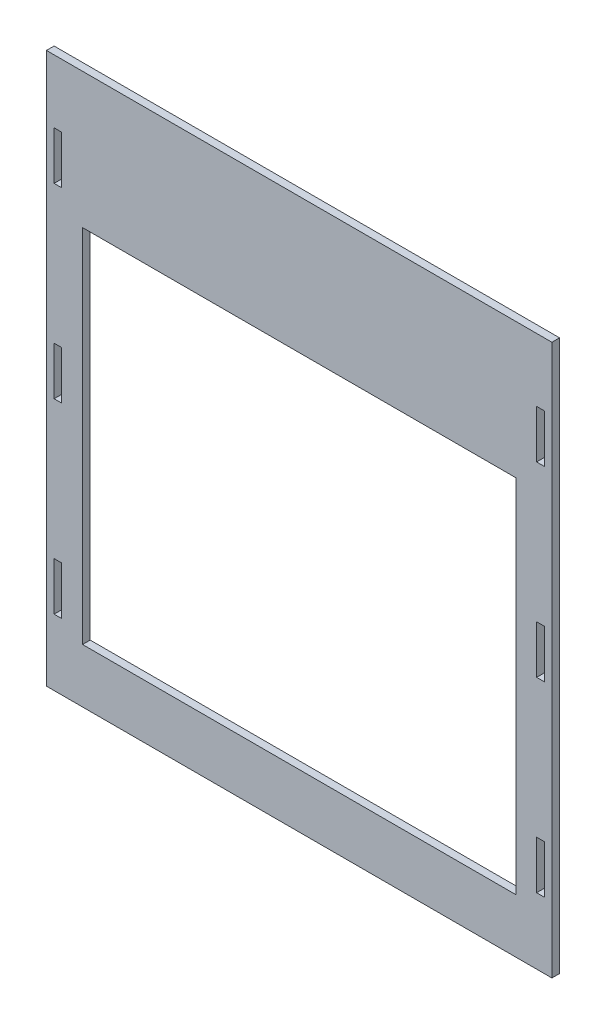
ISO-10303-21;
HEADER;
FILE_DESCRIPTION(('STEP AP214'),'2;1');
FILE_NAME('part.step','',(''),(''),'','','');
FILE_SCHEMA(('AUTOMOTIVE_DESIGN { 1 0 10303 214 1 1 1 1 }'));
ENDSEC;
DATA;
#1=APPLICATION_CONTEXT('core data for automotive mechanical design processes');
#2=APPLICATION_PROTOCOL_DEFINITION('international standard','automotive_design',2000,#1);
#3=PRODUCT_CONTEXT('',#1,'mechanical');
#4=PRODUCT('Part','Part','',(#3));
#5=PRODUCT_RELATED_PRODUCT_CATEGORY('part','',(#4));
#6=PRODUCT_DEFINITION_FORMATION('','',#4);
#7=PRODUCT_DEFINITION_CONTEXT('part definition',#1,'design');
#8=PRODUCT_DEFINITION('design','',#6,#7);
#9=PRODUCT_DEFINITION_SHAPE('','',#8);
#10=(LENGTH_UNIT() NAMED_UNIT(*) SI_UNIT(.MILLI.,.METRE.));
#11=(NAMED_UNIT(*) PLANE_ANGLE_UNIT() SI_UNIT($,.RADIAN.));
#12=(NAMED_UNIT(*) SI_UNIT($,.STERADIAN.) SOLID_ANGLE_UNIT());
#13=UNCERTAINTY_MEASURE_WITH_UNIT(LENGTH_MEASURE(1.E-05),#10,'distance_accuracy_value','');
#14=(GEOMETRIC_REPRESENTATION_CONTEXT(3) GLOBAL_UNCERTAINTY_ASSIGNED_CONTEXT((#13)) GLOBAL_UNIT_ASSIGNED_CONTEXT((#10,
#11,#12)) REPRESENTATION_CONTEXT('',''));
#15=CARTESIAN_POINT('',(0.,0.,0.));
#16=DIRECTION('',(0.,0.,1.));
#17=DIRECTION('',(1.,0.,0.));
#18=AXIS2_PLACEMENT_3D('',#15,#16,#17);
#19=CARTESIAN_POINT('',(0.,0.,6.35));
#20=DIRECTION('',(0.,0.,-1.));
#21=DIRECTION('',(-1.,0.,0.));
#22=AXIS2_PLACEMENT_3D('',#19,#20,#21);
#23=PLANE('',#22);
#24=DIRECTION('',(-1.,0.,0.));
#25=VECTOR('',#24,1.);
#26=CARTESIAN_POINT('',(407.3,95.,6.35));
#27=LINE('',#26,#25);
#28=CARTESIAN_POINT('',(413.65,95.,6.35));
#29=VERTEX_POINT('',#28);
#30=CARTESIAN_POINT('',(407.3,95.,6.35));
#31=VERTEX_POINT('',#30);
#32=EDGE_CURVE('E281',#29,#31,#27,.T.);
#33=ORIENTED_EDGE('',*,*,#32,.F.);
#34=DIRECTION('',(0.,1.,0.));
#35=VECTOR('',#34,1.);
#36=CARTESIAN_POINT('',(413.65,95.,6.35));
#37=LINE('',#36,#35);
#38=CARTESIAN_POINT('',(413.65,55.,6.35));
#39=VERTEX_POINT('',#38);
#40=EDGE_CURVE('E289',#39,#29,#37,.T.);
#41=ORIENTED_EDGE('',*,*,#40,.F.);
#42=DIRECTION('',(1.,0.,0.));
#43=VECTOR('',#42,1.);
#44=CARTESIAN_POINT('',(413.65,55.,6.35));
#45=LINE('',#44,#43);
#46=CARTESIAN_POINT('',(407.3,55.,6.35));
#47=VERTEX_POINT('',#46);
#48=EDGE_CURVE('E286',#47,#39,#45,.T.);
#49=ORIENTED_EDGE('',*,*,#48,.F.);
#50=DIRECTION('',(0.,-1.,0.));
#51=VECTOR('',#50,1.);
#52=CARTESIAN_POINT('',(407.3,55.,6.35));
#53=LINE('',#52,#51);
#54=EDGE_CURVE('E283',#31,#47,#53,.T.);
#55=ORIENTED_EDGE('',*,*,#54,.F.);
#56=EDGE_LOOP('',(#33,#41,#49,#55));
#57=FACE_BOUND('',#56,.T.);
#58=DIRECTION('',(-1.,0.,0.));
#59=VECTOR('',#58,1.);
#60=CARTESIAN_POINT('',(6.35000000000008,250.,6.35));
#61=LINE('',#60,#59);
#62=CARTESIAN_POINT('',(12.7,250.,6.35));
#63=VERTEX_POINT('',#62);
#64=CARTESIAN_POINT('',(6.35000000000008,250.,6.35));
#65=VERTEX_POINT('',#64);
#66=EDGE_CURVE('E343',#63,#65,#61,.T.);
#67=ORIENTED_EDGE('',*,*,#66,.F.);
#68=DIRECTION('',(0.,1.,0.));
#69=VECTOR('',#68,1.);
#70=CARTESIAN_POINT('',(12.7,250.,6.35));
#71=LINE('',#70,#69);
#72=CARTESIAN_POINT('',(12.7,210.,6.35));
#73=VERTEX_POINT('',#72);
#74=EDGE_CURVE('E351',#73,#63,#71,.T.);
#75=ORIENTED_EDGE('',*,*,#74,.F.);
#76=DIRECTION('',(1.,0.,0.));
#77=VECTOR('',#76,1.);
#78=CARTESIAN_POINT('',(12.7,210.,6.35));
#79=LINE('',#78,#77);
#80=CARTESIAN_POINT('',(6.35000000000009,210.,6.35));
#81=VERTEX_POINT('',#80);
#82=EDGE_CURVE('E348',#81,#73,#79,.T.);
#83=ORIENTED_EDGE('',*,*,#82,.F.);
#84=DIRECTION('',(0.,-1.,0.));
#85=VECTOR('',#84,1.);
#86=CARTESIAN_POINT('',(6.35000000000009,210.,6.35));
#87=LINE('',#86,#85);
#88=EDGE_CURVE('E345',#65,#81,#87,.T.);
#89=ORIENTED_EDGE('',*,*,#88,.F.);
#90=EDGE_LOOP('',(#67,#75,#83,#89));
#91=FACE_BOUND('',#90,.T.);
#92=DIRECTION('',(0.,-1.,0.));
#93=VECTOR('',#92,1.);
#94=CARTESIAN_POINT('',(407.3,365.,6.35));
#95=LINE('',#94,#93);
#96=CARTESIAN_POINT('',(407.3,405.,6.35));
#97=VERTEX_POINT('',#96);
#98=CARTESIAN_POINT('',(407.3,365.,6.35));
#99=VERTEX_POINT('',#98);
#100=EDGE_CURVE('E405',#97,#99,#95,.T.);
#101=ORIENTED_EDGE('',*,*,#100,.F.);
#102=DIRECTION('',(-1.,0.,0.));
#103=VECTOR('',#102,1.);
#104=CARTESIAN_POINT('',(407.3,405.,6.35));
#105=LINE('',#104,#103);
#106=CARTESIAN_POINT('',(413.65,405.,6.35));
#107=VERTEX_POINT('',#106);
#108=EDGE_CURVE('E413',#107,#97,#105,.T.);
#109=ORIENTED_EDGE('',*,*,#108,.F.);
#110=DIRECTION('',(0.,1.,0.));
#111=VECTOR('',#110,1.);
#112=CARTESIAN_POINT('',(413.65,405.,6.35));
#113=LINE('',#112,#111);
#114=CARTESIAN_POINT('',(413.65,365.,6.35));
#115=VERTEX_POINT('',#114);
#116=EDGE_CURVE('E410',#115,#107,#113,.T.);
#117=ORIENTED_EDGE('',*,*,#116,.F.);
#118=DIRECTION('',(1.,0.,0.));
#119=VECTOR('',#118,1.);
#120=CARTESIAN_POINT('',(413.65,365.,6.35));
#121=LINE('',#120,#119);
#122=EDGE_CURVE('E407',#99,#115,#121,.T.);
#123=ORIENTED_EDGE('',*,*,#122,.F.);
#124=EDGE_LOOP('',(#101,#109,#117,#123));
#125=FACE_BOUND('',#124,.T.);
#126=DIRECTION('',(0.,-1.,0.));
#127=VECTOR('',#126,1.);
#128=CARTESIAN_POINT('',(0.,0.,6.35));
#129=LINE('',#128,#127);
#130=CARTESIAN_POINT('',(0.,457.5,6.35));
#131=VERTEX_POINT('',#130);
#132=CARTESIAN_POINT('',(0.,0.,6.35));
#133=VERTEX_POINT('',#132);
#134=EDGE_CURVE('E467',#131,#133,#129,.T.);
#135=ORIENTED_EDGE('',*,*,#134,.T.);
#136=DIRECTION('',(1.,0.,0.));
#137=VECTOR('',#136,1.);
#138=CARTESIAN_POINT('',(0.,0.,6.35));
#139=LINE('',#138,#137);
#140=CARTESIAN_POINT('',(420.,0.,6.35));
#141=VERTEX_POINT('',#140);
#142=EDGE_CURVE('E470',#133,#141,#139,.T.);
#143=ORIENTED_EDGE('',*,*,#142,.T.);
#144=DIRECTION('',(0.,1.,0.));
#145=VECTOR('',#144,1.);
#146=CARTESIAN_POINT('',(420.,0.,6.35));
#147=LINE('',#146,#145);
#148=CARTESIAN_POINT('',(420.,457.5,6.35));
#149=VERTEX_POINT('',#148);
#150=EDGE_CURVE('E473',#141,#149,#147,.T.);
#151=ORIENTED_EDGE('',*,*,#150,.T.);
#152=DIRECTION('',(-1.,0.,0.));
#153=VECTOR('',#152,1.);
#154=CARTESIAN_POINT('',(413.65,457.5,6.35));
#155=LINE('',#154,#153);
#156=EDGE_CURVE('E475',#149,#131,#155,.T.);
#157=ORIENTED_EDGE('',*,*,#156,.T.);
#158=EDGE_LOOP('',(#135,#143,#151,#157));
#159=FACE_BOUND('',#158,.T.);
#160=DIRECTION('',(0.,-1.,0.));
#161=VECTOR('',#160,1.);
#162=CARTESIAN_POINT('',(30.,345.,6.35));
#163=LINE('',#162,#161);
#164=CARTESIAN_POINT('',(30.,345.,6.35));
#165=VERTEX_POINT('',#164);
#166=CARTESIAN_POINT('',(30.,45.,6.35));
#167=VERTEX_POINT('',#166);
#168=EDGE_CURVE('E436',#165,#167,#163,.T.);
#169=ORIENTED_EDGE('',*,*,#168,.F.);
#170=DIRECTION('',(-1.,0.,0.));
#171=VECTOR('',#170,1.);
#172=CARTESIAN_POINT('',(30.,345.,6.35));
#173=LINE('',#172,#171);
#174=CARTESIAN_POINT('',(390.,345.,6.35));
#175=VERTEX_POINT('',#174);
#176=EDGE_CURVE('E444',#175,#165,#173,.T.);
#177=ORIENTED_EDGE('',*,*,#176,.F.);
#178=DIRECTION('',(0.,1.,0.));
#179=VECTOR('',#178,1.);
#180=CARTESIAN_POINT('',(390.,345.,6.35));
#181=LINE('',#180,#179);
#182=CARTESIAN_POINT('',(390.,45.,6.35));
#183=VERTEX_POINT('',#182);
#184=EDGE_CURVE('E441',#183,#175,#181,.T.);
#185=ORIENTED_EDGE('',*,*,#184,.F.);
#186=DIRECTION('',(1.,0.,0.));
#187=VECTOR('',#186,1.);
#188=CARTESIAN_POINT('',(30.,45.,6.35));
#189=LINE('',#188,#187);
#190=EDGE_CURVE('E438',#167,#183,#189,.T.);
#191=ORIENTED_EDGE('',*,*,#190,.F.);
#192=EDGE_LOOP('',(#169,#177,#185,#191));
#193=FACE_BOUND('',#192,.T.);
#194=DIRECTION('',(-1.,0.,0.));
#195=VECTOR('',#194,1.);
#196=CARTESIAN_POINT('',(6.35,405.,6.35));
#197=LINE('',#196,#195);
#198=CARTESIAN_POINT('',(12.7,405.,6.35));
#199=VERTEX_POINT('',#198);
#200=CARTESIAN_POINT('',(6.35,405.,6.35));
#201=VERTEX_POINT('',#200);
#202=EDGE_CURVE('E374',#199,#201,#197,.T.);
#203=ORIENTED_EDGE('',*,*,#202,.F.);
#204=DIRECTION('',(0.,1.,0.));
#205=VECTOR('',#204,1.);
#206=CARTESIAN_POINT('',(12.7,365.,6.35));
#207=LINE('',#206,#205);
#208=CARTESIAN_POINT('',(12.7,365.,6.35));
#209=VERTEX_POINT('',#208);
#210=EDGE_CURVE('E382',#209,#199,#207,.T.);
#211=ORIENTED_EDGE('',*,*,#210,.F.);
#212=DIRECTION('',(1.,0.,0.));
#213=VECTOR('',#212,1.);
#214=CARTESIAN_POINT('',(6.35000000000001,365.,6.35));
#215=LINE('',#214,#213);
#216=CARTESIAN_POINT('',(6.35000000000001,365.,6.35));
#217=VERTEX_POINT('',#216);
#218=EDGE_CURVE('E379',#217,#209,#215,.T.);
#219=ORIENTED_EDGE('',*,*,#218,.F.);
#220=DIRECTION('',(0.,-1.,0.));
#221=VECTOR('',#220,1.);
#222=CARTESIAN_POINT('',(6.35,405.,6.35));
#223=LINE('',#222,#221);
#224=EDGE_CURVE('E376',#201,#217,#223,.T.);
#225=ORIENTED_EDGE('',*,*,#224,.F.);
#226=EDGE_LOOP('',(#203,#211,#219,#225));
#227=FACE_BOUND('',#226,.T.);
#228=DIRECTION('',(-1.,0.,0.));
#229=VECTOR('',#228,1.);
#230=CARTESIAN_POINT('',(407.3,250.,6.35));
#231=LINE('',#230,#229);
#232=CARTESIAN_POINT('',(413.65,250.,6.35));
#233=VERTEX_POINT('',#232);
#234=CARTESIAN_POINT('',(407.3,250.,6.35));
#235=VERTEX_POINT('',#234);
#236=EDGE_CURVE('E312',#233,#235,#231,.T.);
#237=ORIENTED_EDGE('',*,*,#236,.F.);
#238=DIRECTION('',(0.,1.,0.));
#239=VECTOR('',#238,1.);
#240=CARTESIAN_POINT('',(413.65,250.,6.35));
#241=LINE('',#240,#239);
#242=CARTESIAN_POINT('',(413.65,210.,6.35));
#243=VERTEX_POINT('',#242);
#244=EDGE_CURVE('E320',#243,#233,#241,.T.);
#245=ORIENTED_EDGE('',*,*,#244,.F.);
#246=DIRECTION('',(1.,0.,0.));
#247=VECTOR('',#246,1.);
#248=CARTESIAN_POINT('',(413.65,210.,6.35));
#249=LINE('',#248,#247);
#250=CARTESIAN_POINT('',(407.3,210.,6.35));
#251=VERTEX_POINT('',#250);
#252=EDGE_CURVE('E317',#251,#243,#249,.T.);
#253=ORIENTED_EDGE('',*,*,#252,.F.);
#254=DIRECTION('',(0.,-1.,0.));
#255=VECTOR('',#254,1.);
#256=CARTESIAN_POINT('',(407.3,210.,6.35));
#257=LINE('',#256,#255);
#258=EDGE_CURVE('E314',#235,#251,#257,.T.);
#259=ORIENTED_EDGE('',*,*,#258,.F.);
#260=EDGE_LOOP('',(#237,#245,#253,#259));
#261=FACE_BOUND('',#260,.T.);
#262=DIRECTION('',(-1.,0.,0.));
#263=VECTOR('',#262,1.);
#264=CARTESIAN_POINT('',(6.35000000000003,95.,6.35));
#265=LINE('',#264,#263);
#266=CARTESIAN_POINT('',(12.7,95.,6.35));
#267=VERTEX_POINT('',#266);
#268=CARTESIAN_POINT('',(6.35000000000003,95.,6.35));
#269=VERTEX_POINT('',#268);
#270=EDGE_CURVE('E245',#267,#269,#265,.T.);
#271=ORIENTED_EDGE('',*,*,#270,.F.);
#272=DIRECTION('',(0.,1.,0.));
#273=VECTOR('',#272,1.);
#274=CARTESIAN_POINT('',(12.7,95.,6.35));
#275=LINE('',#274,#273);
#276=CARTESIAN_POINT('',(12.7,55.,6.35));
#277=VERTEX_POINT('',#276);
#278=EDGE_CURVE('E267',#277,#267,#275,.T.);
#279=ORIENTED_EDGE('',*,*,#278,.F.);
#280=DIRECTION('',(1.,0.,0.));
#281=VECTOR('',#280,1.);
#282=CARTESIAN_POINT('',(12.7,55.,6.35));
#283=LINE('',#282,#281);
#284=CARTESIAN_POINT('',(6.35000000000003,55.,6.35));
#285=VERTEX_POINT('',#284);
#286=EDGE_CURVE('E265',#285,#277,#283,.T.);
#287=ORIENTED_EDGE('',*,*,#286,.F.);
#288=DIRECTION('',(0.,-1.,0.));
#289=VECTOR('',#288,1.);
#290=CARTESIAN_POINT('',(6.35000000000003,55.,6.35));
#291=LINE('',#290,#289);
#292=EDGE_CURVE('E253',#269,#285,#291,.T.);
#293=ORIENTED_EDGE('',*,*,#292,.F.);
#294=EDGE_LOOP('',(#271,#279,#287,#293));
#295=FACE_BOUND('',#294,.T.);
#296=ADVANCED_FACE('F36',(#57,#91,#125,#159,#193,#227,#261,#295),#23,.F.);
#297=CARTESIAN_POINT('',(0.,0.,0.));
#298=DIRECTION('',(0.,0.,-1.));
#299=DIRECTION('',(-1.,0.,0.));
#300=AXIS2_PLACEMENT_3D('',#297,#298,#299);
#301=PLANE('',#300);
#302=DIRECTION('',(0.,-1.,0.));
#303=VECTOR('',#302,1.);
#304=CARTESIAN_POINT('',(0.,0.,0.));
#305=LINE('',#304,#303);
#306=CARTESIAN_POINT('',(0.,457.5,0.));
#307=VERTEX_POINT('',#306);
#308=CARTESIAN_POINT('',(0.,0.,0.));
#309=VERTEX_POINT('',#308);
#310=EDGE_CURVE('E466',#307,#309,#305,.T.);
#311=ORIENTED_EDGE('',*,*,#310,.F.);
#312=DIRECTION('',(-1.,0.,0.));
#313=VECTOR('',#312,1.);
#314=CARTESIAN_POINT('',(0.,457.5,0.));
#315=LINE('',#314,#313);
#316=CARTESIAN_POINT('',(420.,457.5,0.));
#317=VERTEX_POINT('',#316);
#318=EDGE_CURVE('E471',#317,#307,#315,.T.);
#319=ORIENTED_EDGE('',*,*,#318,.F.);
#320=DIRECTION('',(0.,1.,0.));
#321=VECTOR('',#320,1.);
#322=CARTESIAN_POINT('',(420.,0.,0.));
#323=LINE('',#322,#321);
#324=CARTESIAN_POINT('',(420.,0.,0.));
#325=VERTEX_POINT('',#324);
#326=EDGE_CURVE('E482',#325,#317,#323,.T.);
#327=ORIENTED_EDGE('',*,*,#326,.F.);
#328=DIRECTION('',(1.,0.,0.));
#329=VECTOR('',#328,1.);
#330=CARTESIAN_POINT('',(0.,0.,0.));
#331=LINE('',#330,#329);
#332=EDGE_CURVE('E480',#309,#325,#331,.T.);
#333=ORIENTED_EDGE('',*,*,#332,.F.);
#334=EDGE_LOOP('',(#311,#319,#327,#333));
#335=FACE_BOUND('',#334,.T.);
#336=DIRECTION('',(-1.,0.,0.));
#337=VECTOR('',#336,1.);
#338=CARTESIAN_POINT('',(30.,345.,0.));
#339=LINE('',#338,#337);
#340=CARTESIAN_POINT('',(390.,345.,0.));
#341=VERTEX_POINT('',#340);
#342=CARTESIAN_POINT('',(30.,345.,0.));
#343=VERTEX_POINT('',#342);
#344=EDGE_CURVE('E439',#341,#343,#339,.T.);
#345=ORIENTED_EDGE('',*,*,#344,.T.);
#346=DIRECTION('',(0.,-1.,0.));
#347=VECTOR('',#346,1.);
#348=CARTESIAN_POINT('',(30.,345.,0.));
#349=LINE('',#348,#347);
#350=CARTESIAN_POINT('',(30.,45.,0.));
#351=VERTEX_POINT('',#350);
#352=EDGE_CURVE('E435',#343,#351,#349,.T.);
#353=ORIENTED_EDGE('',*,*,#352,.T.);
#354=DIRECTION('',(1.,0.,0.));
#355=VECTOR('',#354,1.);
#356=CARTESIAN_POINT('',(30.,45.,0.));
#357=LINE('',#356,#355);
#358=CARTESIAN_POINT('',(390.,45.,0.));
#359=VERTEX_POINT('',#358);
#360=EDGE_CURVE('E449',#351,#359,#357,.T.);
#361=ORIENTED_EDGE('',*,*,#360,.T.);
#362=DIRECTION('',(0.,1.,0.));
#363=VECTOR('',#362,1.);
#364=CARTESIAN_POINT('',(390.,345.,0.));
#365=LINE('',#364,#363);
#366=EDGE_CURVE('E452',#359,#341,#365,.T.);
#367=ORIENTED_EDGE('',*,*,#366,.T.);
#368=EDGE_LOOP('',(#345,#353,#361,#367));
#369=FACE_BOUND('',#368,.T.);
#370=DIRECTION('',(-1.,0.,0.));
#371=VECTOR('',#370,1.);
#372=CARTESIAN_POINT('',(407.3,405.,0.));
#373=LINE('',#372,#371);
#374=CARTESIAN_POINT('',(413.65,405.,0.));
#375=VERTEX_POINT('',#374);
#376=CARTESIAN_POINT('',(407.3,405.,0.));
#377=VERTEX_POINT('',#376);
#378=EDGE_CURVE('E408',#375,#377,#373,.T.);
#379=ORIENTED_EDGE('',*,*,#378,.T.);
#380=DIRECTION('',(0.,-1.,0.));
#381=VECTOR('',#380,1.);
#382=CARTESIAN_POINT('',(407.3,365.,0.));
#383=LINE('',#382,#381);
#384=CARTESIAN_POINT('',(407.3,365.,0.));
#385=VERTEX_POINT('',#384);
#386=EDGE_CURVE('E404',#377,#385,#383,.T.);
#387=ORIENTED_EDGE('',*,*,#386,.T.);
#388=DIRECTION('',(1.,0.,0.));
#389=VECTOR('',#388,1.);
#390=CARTESIAN_POINT('',(413.65,365.,0.));
#391=LINE('',#390,#389);
#392=CARTESIAN_POINT('',(413.65,365.,0.));
#393=VERTEX_POINT('',#392);
#394=EDGE_CURVE('E418',#385,#393,#391,.T.);
#395=ORIENTED_EDGE('',*,*,#394,.T.);
#396=DIRECTION('',(0.,1.,0.));
#397=VECTOR('',#396,1.);
#398=CARTESIAN_POINT('',(413.65,405.,0.));
#399=LINE('',#398,#397);
#400=EDGE_CURVE('E421',#393,#375,#399,.T.);
#401=ORIENTED_EDGE('',*,*,#400,.T.);
#402=EDGE_LOOP('',(#379,#387,#395,#401));
#403=FACE_BOUND('',#402,.T.);
#404=DIRECTION('',(0.,1.,0.));
#405=VECTOR('',#404,1.);
#406=CARTESIAN_POINT('',(12.7,365.,0.));
#407=LINE('',#406,#405);
#408=CARTESIAN_POINT('',(12.7,365.,0.));
#409=VERTEX_POINT('',#408);
#410=CARTESIAN_POINT('',(12.7,405.,0.));
#411=VERTEX_POINT('',#410);
#412=EDGE_CURVE('E377',#409,#411,#407,.T.);
#413=ORIENTED_EDGE('',*,*,#412,.T.);
#414=DIRECTION('',(-1.,0.,0.));
#415=VECTOR('',#414,1.);
#416=CARTESIAN_POINT('',(6.35,405.,0.));
#417=LINE('',#416,#415);
#418=CARTESIAN_POINT('',(6.35,405.,0.));
#419=VERTEX_POINT('',#418);
#420=EDGE_CURVE('E373',#411,#419,#417,.T.);
#421=ORIENTED_EDGE('',*,*,#420,.T.);
#422=DIRECTION('',(0.,-1.,0.));
#423=VECTOR('',#422,1.);
#424=CARTESIAN_POINT('',(6.35,405.,0.));
#425=LINE('',#424,#423);
#426=CARTESIAN_POINT('',(6.35000000000001,365.,0.));
#427=VERTEX_POINT('',#426);
#428=EDGE_CURVE('E387',#419,#427,#425,.T.);
#429=ORIENTED_EDGE('',*,*,#428,.T.);
#430=DIRECTION('',(1.,0.,0.));
#431=VECTOR('',#430,1.);
#432=CARTESIAN_POINT('',(6.35000000000001,365.,0.));
#433=LINE('',#432,#431);
#434=EDGE_CURVE('E390',#427,#409,#433,.T.);
#435=ORIENTED_EDGE('',*,*,#434,.T.);
#436=EDGE_LOOP('',(#413,#421,#429,#435));
#437=FACE_BOUND('',#436,.T.);
#438=DIRECTION('',(0.,1.,0.));
#439=VECTOR('',#438,1.);
#440=CARTESIAN_POINT('',(12.7,250.,0.));
#441=LINE('',#440,#439);
#442=CARTESIAN_POINT('',(12.7,210.,0.));
#443=VERTEX_POINT('',#442);
#444=CARTESIAN_POINT('',(12.7,250.,0.));
#445=VERTEX_POINT('',#444);
#446=EDGE_CURVE('E346',#443,#445,#441,.T.);
#447=ORIENTED_EDGE('',*,*,#446,.T.);
#448=DIRECTION('',(-1.,0.,0.));
#449=VECTOR('',#448,1.);
#450=CARTESIAN_POINT('',(6.35000000000008,250.,0.));
#451=LINE('',#450,#449);
#452=CARTESIAN_POINT('',(6.35000000000008,250.,0.));
#453=VERTEX_POINT('',#452);
#454=EDGE_CURVE('E342',#445,#453,#451,.T.);
#455=ORIENTED_EDGE('',*,*,#454,.T.);
#456=DIRECTION('',(0.,-1.,0.));
#457=VECTOR('',#456,1.);
#458=CARTESIAN_POINT('',(6.35000000000009,210.,0.));
#459=LINE('',#458,#457);
#460=CARTESIAN_POINT('',(6.35000000000009,210.,0.));
#461=VERTEX_POINT('',#460);
#462=EDGE_CURVE('E356',#453,#461,#459,.T.);
#463=ORIENTED_EDGE('',*,*,#462,.T.);
#464=DIRECTION('',(1.,0.,0.));
#465=VECTOR('',#464,1.);
#466=CARTESIAN_POINT('',(12.7,210.,0.));
#467=LINE('',#466,#465);
#468=EDGE_CURVE('E359',#461,#443,#467,.T.);
#469=ORIENTED_EDGE('',*,*,#468,.T.);
#470=EDGE_LOOP('',(#447,#455,#463,#469));
#471=FACE_BOUND('',#470,.T.);
#472=DIRECTION('',(0.,1.,0.));
#473=VECTOR('',#472,1.);
#474=CARTESIAN_POINT('',(413.65,250.,0.));
#475=LINE('',#474,#473);
#476=CARTESIAN_POINT('',(413.65,210.,0.));
#477=VERTEX_POINT('',#476);
#478=CARTESIAN_POINT('',(413.65,250.,0.));
#479=VERTEX_POINT('',#478);
#480=EDGE_CURVE('E315',#477,#479,#475,.T.);
#481=ORIENTED_EDGE('',*,*,#480,.T.);
#482=DIRECTION('',(-1.,0.,0.));
#483=VECTOR('',#482,1.);
#484=CARTESIAN_POINT('',(407.3,250.,0.));
#485=LINE('',#484,#483);
#486=CARTESIAN_POINT('',(407.3,250.,0.));
#487=VERTEX_POINT('',#486);
#488=EDGE_CURVE('E311',#479,#487,#485,.T.);
#489=ORIENTED_EDGE('',*,*,#488,.T.);
#490=DIRECTION('',(0.,-1.,0.));
#491=VECTOR('',#490,1.);
#492=CARTESIAN_POINT('',(407.3,210.,0.));
#493=LINE('',#492,#491);
#494=CARTESIAN_POINT('',(407.3,210.,0.));
#495=VERTEX_POINT('',#494);
#496=EDGE_CURVE('E325',#487,#495,#493,.T.);
#497=ORIENTED_EDGE('',*,*,#496,.T.);
#498=DIRECTION('',(1.,0.,0.));
#499=VECTOR('',#498,1.);
#500=CARTESIAN_POINT('',(413.65,210.,0.));
#501=LINE('',#500,#499);
#502=EDGE_CURVE('E328',#495,#477,#501,.T.);
#503=ORIENTED_EDGE('',*,*,#502,.T.);
#504=EDGE_LOOP('',(#481,#489,#497,#503));
#505=FACE_BOUND('',#504,.T.);
#506=DIRECTION('',(0.,1.,0.));
#507=VECTOR('',#506,1.);
#508=CARTESIAN_POINT('',(413.65,95.,0.));
#509=LINE('',#508,#507);
#510=CARTESIAN_POINT('',(413.65,55.,0.));
#511=VERTEX_POINT('',#510);
#512=CARTESIAN_POINT('',(413.65,95.,0.));
#513=VERTEX_POINT('',#512);
#514=EDGE_CURVE('E284',#511,#513,#509,.T.);
#515=ORIENTED_EDGE('',*,*,#514,.T.);
#516=DIRECTION('',(-1.,0.,0.));
#517=VECTOR('',#516,1.);
#518=CARTESIAN_POINT('',(407.3,95.,0.));
#519=LINE('',#518,#517);
#520=CARTESIAN_POINT('',(407.3,95.,0.));
#521=VERTEX_POINT('',#520);
#522=EDGE_CURVE('E261',#513,#521,#519,.T.);
#523=ORIENTED_EDGE('',*,*,#522,.T.);
#524=DIRECTION('',(0.,-1.,0.));
#525=VECTOR('',#524,1.);
#526=CARTESIAN_POINT('',(407.3,55.,0.));
#527=LINE('',#526,#525);
#528=CARTESIAN_POINT('',(407.3,55.,0.));
#529=VERTEX_POINT('',#528);
#530=EDGE_CURVE('E294',#521,#529,#527,.T.);
#531=ORIENTED_EDGE('',*,*,#530,.T.);
#532=DIRECTION('',(1.,0.,0.));
#533=VECTOR('',#532,1.);
#534=CARTESIAN_POINT('',(413.65,55.,0.));
#535=LINE('',#534,#533);
#536=EDGE_CURVE('E297',#529,#511,#535,.T.);
#537=ORIENTED_EDGE('',*,*,#536,.T.);
#538=EDGE_LOOP('',(#515,#523,#531,#537));
#539=FACE_BOUND('',#538,.T.);
#540=DIRECTION('',(0.,1.,0.));
#541=VECTOR('',#540,1.);
#542=CARTESIAN_POINT('',(12.7,95.,0.));
#543=LINE('',#542,#541);
#544=CARTESIAN_POINT('',(12.7,55.,0.));
#545=VERTEX_POINT('',#544);
#546=CARTESIAN_POINT('',(12.7,95.,0.));
#547=VERTEX_POINT('',#546);
#548=EDGE_CURVE('E254',#545,#547,#543,.T.);
#549=ORIENTED_EDGE('',*,*,#548,.T.);
#550=DIRECTION('',(-1.,0.,0.));
#551=VECTOR('',#550,1.);
#552=CARTESIAN_POINT('',(6.35000000000003,95.,0.));
#553=LINE('',#552,#551);
#554=CARTESIAN_POINT('',(6.35000000000003,95.,0.));
#555=VERTEX_POINT('',#554);
#556=EDGE_CURVE('E59',#547,#555,#553,.T.);
#557=ORIENTED_EDGE('',*,*,#556,.T.);
#558=DIRECTION('',(0.,-1.,0.));
#559=VECTOR('',#558,1.);
#560=CARTESIAN_POINT('',(6.35000000000003,55.,0.));
#561=LINE('',#560,#559);
#562=CARTESIAN_POINT('',(6.35000000000003,55.,0.));
#563=VERTEX_POINT('',#562);
#564=EDGE_CURVE('E260',#555,#563,#561,.T.);
#565=ORIENTED_EDGE('',*,*,#564,.T.);
#566=DIRECTION('',(1.,0.,0.));
#567=VECTOR('',#566,1.);
#568=CARTESIAN_POINT('',(12.7,55.,0.));
#569=LINE('',#568,#567);
#570=EDGE_CURVE('E273',#563,#545,#569,.T.);
#571=ORIENTED_EDGE('',*,*,#570,.T.);
#572=EDGE_LOOP('',(#549,#557,#565,#571));
#573=FACE_BOUND('',#572,.T.);
#574=ADVANCED_FACE('F500',(#335,#369,#403,#437,#471,#505,#539,#573),#301,.T.);
#575=CARTESIAN_POINT('',(0.,0.,6.35));
#576=DIRECTION('',(1.,0.,0.));
#577=DIRECTION('',(0.,0.,-1.));
#578=AXIS2_PLACEMENT_3D('',#575,#576,#577);
#579=PLANE('',#578);
#580=ORIENTED_EDGE('',*,*,#310,.T.);
#581=DIRECTION('',(0.,0.,-1.));
#582=VECTOR('',#581,1.);
#583=CARTESIAN_POINT('',(0.,0.,6.35));
#584=LINE('',#583,#582);
#585=EDGE_CURVE('E11',#133,#309,#584,.T.);
#586=ORIENTED_EDGE('',*,*,#585,.F.);
#587=ORIENTED_EDGE('',*,*,#134,.F.);
#588=DIRECTION('',(0.,0.,-1.));
#589=VECTOR('',#588,1.);
#590=CARTESIAN_POINT('',(0.,457.5,6.35));
#591=LINE('',#590,#589);
#592=EDGE_CURVE('E477',#131,#307,#591,.T.);
#593=ORIENTED_EDGE('',*,*,#592,.T.);
#594=EDGE_LOOP('',(#580,#586,#587,#593));
#595=FACE_BOUND('',#594,.T.);
#596=ADVANCED_FACE('F38',(#595),#579,.F.);
#597=CARTESIAN_POINT('',(0.,0.,6.35));
#598=DIRECTION('',(0.,1.,0.));
#599=DIRECTION('',(0.,0.,1.));
#600=AXIS2_PLACEMENT_3D('',#597,#598,#599);
#601=PLANE('',#600);
#602=ORIENTED_EDGE('',*,*,#332,.T.);
#603=DIRECTION('',(0.,0.,-1.));
#604=VECTOR('',#603,1.);
#605=CARTESIAN_POINT('',(420.,0.,6.35));
#606=LINE('',#605,#604);
#607=EDGE_CURVE('E44',#141,#325,#606,.T.);
#608=ORIENTED_EDGE('',*,*,#607,.F.);
#609=ORIENTED_EDGE('',*,*,#142,.F.);
#610=ORIENTED_EDGE('',*,*,#585,.T.);
#611=EDGE_LOOP('',(#602,#608,#609,#610));
#612=FACE_BOUND('',#611,.T.);
#613=ADVANCED_FACE('F511',(#612),#601,.F.);
#614=CARTESIAN_POINT('',(420.,0.,6.35));
#615=DIRECTION('',(-1.,0.,0.));
#616=DIRECTION('',(0.,-1.,0.));
#617=AXIS2_PLACEMENT_3D('',#614,#615,#616);
#618=PLANE('',#617);
#619=ORIENTED_EDGE('',*,*,#326,.T.);
#620=DIRECTION('',(0.,0.,-1.));
#621=VECTOR('',#620,1.);
#622=CARTESIAN_POINT('',(420.,457.5,6.35));
#623=LINE('',#622,#621);
#624=EDGE_CURVE('E488',#149,#317,#623,.T.);
#625=ORIENTED_EDGE('',*,*,#624,.F.);
#626=ORIENTED_EDGE('',*,*,#150,.F.);
#627=ORIENTED_EDGE('',*,*,#607,.T.);
#628=EDGE_LOOP('',(#619,#625,#626,#627));
#629=FACE_BOUND('',#628,.T.);
#630=ADVANCED_FACE('F495',(#629),#618,.F.);
#631=CARTESIAN_POINT('',(0.,457.5,6.35));
#632=DIRECTION('',(0.,-1.,0.));
#633=DIRECTION('',(0.,0.,-1.));
#634=AXIS2_PLACEMENT_3D('',#631,#632,#633);
#635=PLANE('',#634);
#636=ORIENTED_EDGE('',*,*,#318,.T.);
#637=ORIENTED_EDGE('',*,*,#592,.F.);
#638=ORIENTED_EDGE('',*,*,#156,.F.);
#639=ORIENTED_EDGE('',*,*,#624,.T.);
#640=EDGE_LOOP('',(#636,#637,#638,#639));
#641=FACE_BOUND('',#640,.T.);
#642=ADVANCED_FACE('F504',(#641),#635,.F.);
#643=CARTESIAN_POINT('',(30.,345.,6.35));
#644=DIRECTION('',(1.,0.,0.));
#645=DIRECTION('',(0.,1.,0.));
#646=AXIS2_PLACEMENT_3D('',#643,#644,#645);
#647=PLANE('',#646);
#648=ORIENTED_EDGE('',*,*,#352,.F.);
#649=DIRECTION('',(0.,0.,-1.));
#650=VECTOR('',#649,1.);
#651=CARTESIAN_POINT('',(30.,345.,6.35));
#652=LINE('',#651,#650);
#653=EDGE_CURVE('E446',#165,#343,#652,.T.);
#654=ORIENTED_EDGE('',*,*,#653,.F.);
#655=ORIENTED_EDGE('',*,*,#168,.T.);
#656=DIRECTION('',(0.,0.,-1.));
#657=VECTOR('',#656,1.);
#658=CARTESIAN_POINT('',(30.,45.,6.35));
#659=LINE('',#658,#657);
#660=EDGE_CURVE('E463',#167,#351,#659,.T.);
#661=ORIENTED_EDGE('',*,*,#660,.T.);
#662=EDGE_LOOP('',(#648,#654,#655,#661));
#663=FACE_BOUND('',#662,.T.);
#664=ADVANCED_FACE('F528',(#663),#647,.T.);
#665=CARTESIAN_POINT('',(30.,45.,6.35));
#666=DIRECTION('',(0.,1.,0.));
#667=DIRECTION('',(0.,0.,1.));
#668=AXIS2_PLACEMENT_3D('',#665,#666,#667);
#669=PLANE('',#668);
#670=ORIENTED_EDGE('',*,*,#360,.F.);
#671=ORIENTED_EDGE('',*,*,#660,.F.);
#672=ORIENTED_EDGE('',*,*,#190,.T.);
#673=DIRECTION('',(0.,0.,-1.));
#674=VECTOR('',#673,1.);
#675=CARTESIAN_POINT('',(390.,45.,6.35));
#676=LINE('',#675,#674);
#677=EDGE_CURVE('E461',#183,#359,#676,.T.);
#678=ORIENTED_EDGE('',*,*,#677,.T.);
#679=EDGE_LOOP('',(#670,#671,#672,#678));
#680=FACE_BOUND('',#679,.T.);
#681=ADVANCED_FACE('F535',(#680),#669,.T.);
#682=CARTESIAN_POINT('',(390.,345.,6.35));
#683=DIRECTION('',(-1.,0.,0.));
#684=DIRECTION('',(0.,-1.,0.));
#685=AXIS2_PLACEMENT_3D('',#682,#683,#684);
#686=PLANE('',#685);
#687=ORIENTED_EDGE('',*,*,#366,.F.);
#688=ORIENTED_EDGE('',*,*,#677,.F.);
#689=ORIENTED_EDGE('',*,*,#184,.T.);
#690=DIRECTION('',(0.,0.,-1.));
#691=VECTOR('',#690,1.);
#692=CARTESIAN_POINT('',(390.,345.,6.35));
#693=LINE('',#692,#691);
#694=EDGE_CURVE('E459',#175,#341,#693,.T.);
#695=ORIENTED_EDGE('',*,*,#694,.T.);
#696=EDGE_LOOP('',(#687,#688,#689,#695));
#697=FACE_BOUND('',#696,.T.);
#698=ADVANCED_FACE('F540',(#697),#686,.T.);
#699=CARTESIAN_POINT('',(30.,345.,6.35));
#700=DIRECTION('',(0.,-1.,0.));
#701=DIRECTION('',(0.,0.,-1.));
#702=AXIS2_PLACEMENT_3D('',#699,#700,#701);
#703=PLANE('',#702);
#704=ORIENTED_EDGE('',*,*,#344,.F.);
#705=ORIENTED_EDGE('',*,*,#694,.F.);
#706=ORIENTED_EDGE('',*,*,#176,.T.);
#707=ORIENTED_EDGE('',*,*,#653,.T.);
#708=EDGE_LOOP('',(#704,#705,#706,#707));
#709=FACE_BOUND('',#708,.T.);
#710=ADVANCED_FACE('F547',(#709),#703,.T.);
#711=CARTESIAN_POINT('',(407.3,365.,6.35));
#712=DIRECTION('',(1.,0.,0.));
#713=DIRECTION('',(0.,0.,-1.));
#714=AXIS2_PLACEMENT_3D('',#711,#712,#713);
#715=PLANE('',#714);
#716=ORIENTED_EDGE('',*,*,#386,.F.);
#717=DIRECTION('',(0.,0.,-1.));
#718=VECTOR('',#717,1.);
#719=CARTESIAN_POINT('',(407.3,405.,6.35));
#720=LINE('',#719,#718);
#721=EDGE_CURVE('E415',#97,#377,#720,.T.);
#722=ORIENTED_EDGE('',*,*,#721,.F.);
#723=ORIENTED_EDGE('',*,*,#100,.T.);
#724=DIRECTION('',(0.,0.,-1.));
#725=VECTOR('',#724,1.);
#726=CARTESIAN_POINT('',(407.3,365.,6.35));
#727=LINE('',#726,#725);
#728=EDGE_CURVE('E432',#99,#385,#727,.T.);
#729=ORIENTED_EDGE('',*,*,#728,.T.);
#730=EDGE_LOOP('',(#716,#722,#723,#729));
#731=FACE_BOUND('',#730,.T.);
#732=ADVANCED_FACE('F635',(#731),#715,.T.);
#733=CARTESIAN_POINT('',(413.65,365.,6.35));
#734=DIRECTION('',(0.,1.,0.));
#735=DIRECTION('',(-1.,0.,0.));
#736=AXIS2_PLACEMENT_3D('',#733,#734,#735);
#737=PLANE('',#736);
#738=ORIENTED_EDGE('',*,*,#394,.F.);
#739=ORIENTED_EDGE('',*,*,#728,.F.);
#740=ORIENTED_EDGE('',*,*,#122,.T.);
#741=DIRECTION('',(0.,0.,-1.));
#742=VECTOR('',#741,1.);
#743=CARTESIAN_POINT('',(413.65,365.,6.35));
#744=LINE('',#743,#742);
#745=EDGE_CURVE('E430',#115,#393,#744,.T.);
#746=ORIENTED_EDGE('',*,*,#745,.T.);
#747=EDGE_LOOP('',(#738,#739,#740,#746));
#748=FACE_BOUND('',#747,.T.);
#749=ADVANCED_FACE('F631',(#748),#737,.T.);
#750=CARTESIAN_POINT('',(413.65,405.,6.35));
#751=DIRECTION('',(-1.,0.,0.));
#752=DIRECTION('',(0.,0.,1.));
#753=AXIS2_PLACEMENT_3D('',#750,#751,#752);
#754=PLANE('',#753);
#755=ORIENTED_EDGE('',*,*,#400,.F.);
#756=ORIENTED_EDGE('',*,*,#745,.F.);
#757=ORIENTED_EDGE('',*,*,#116,.T.);
#758=DIRECTION('',(0.,0.,-1.));
#759=VECTOR('',#758,1.);
#760=CARTESIAN_POINT('',(413.65,405.,6.35));
#761=LINE('',#760,#759);
#762=EDGE_CURVE('E428',#107,#375,#761,.T.);
#763=ORIENTED_EDGE('',*,*,#762,.T.);
#764=EDGE_LOOP('',(#755,#756,#757,#763));
#765=FACE_BOUND('',#764,.T.);
#766=ADVANCED_FACE('F627',(#765),#754,.T.);
#767=CARTESIAN_POINT('',(407.3,405.,6.35));
#768=DIRECTION('',(0.,-1.,0.));
#769=DIRECTION('',(0.,0.,-1.));
#770=AXIS2_PLACEMENT_3D('',#767,#768,#769);
#771=PLANE('',#770);
#772=ORIENTED_EDGE('',*,*,#378,.F.);
#773=ORIENTED_EDGE('',*,*,#762,.F.);
#774=ORIENTED_EDGE('',*,*,#108,.T.);
#775=ORIENTED_EDGE('',*,*,#721,.T.);
#776=EDGE_LOOP('',(#772,#773,#774,#775));
#777=FACE_BOUND('',#776,.T.);
#778=ADVANCED_FACE('F623',(#777),#771,.T.);
#779=CARTESIAN_POINT('',(6.35,405.,6.35));
#780=DIRECTION('',(0.,-1.,0.));
#781=DIRECTION('',(0.,0.,-1.));
#782=AXIS2_PLACEMENT_3D('',#779,#780,#781);
#783=PLANE('',#782);
#784=ORIENTED_EDGE('',*,*,#420,.F.);
#785=DIRECTION('',(0.,0.,-1.));
#786=VECTOR('',#785,1.);
#787=CARTESIAN_POINT('',(12.7,405.,6.35));
#788=LINE('',#787,#786);
#789=EDGE_CURVE('E384',#199,#411,#788,.T.);
#790=ORIENTED_EDGE('',*,*,#789,.F.);
#791=ORIENTED_EDGE('',*,*,#202,.T.);
#792=DIRECTION('',(0.,0.,-1.));
#793=VECTOR('',#792,1.);
#794=CARTESIAN_POINT('',(6.35,405.,6.35));
#795=LINE('',#794,#793);
#796=EDGE_CURVE('E401',#201,#419,#795,.T.);
#797=ORIENTED_EDGE('',*,*,#796,.T.);
#798=EDGE_LOOP('',(#784,#790,#791,#797));
#799=FACE_BOUND('',#798,.T.);
#800=ADVANCED_FACE('F619',(#799),#783,.T.);
#801=CARTESIAN_POINT('',(6.35,405.,6.35));
#802=DIRECTION('',(1.,0.,0.));
#803=DIRECTION('',(0.,1.,0.));
#804=AXIS2_PLACEMENT_3D('',#801,#802,#803);
#805=PLANE('',#804);
#806=ORIENTED_EDGE('',*,*,#428,.F.);
#807=ORIENTED_EDGE('',*,*,#796,.F.);
#808=ORIENTED_EDGE('',*,*,#224,.T.);
#809=DIRECTION('',(0.,0.,-1.));
#810=VECTOR('',#809,1.);
#811=CARTESIAN_POINT('',(6.35000000000001,365.,6.35));
#812=LINE('',#811,#810);
#813=EDGE_CURVE('E399',#217,#427,#812,.T.);
#814=ORIENTED_EDGE('',*,*,#813,.T.);
#815=EDGE_LOOP('',(#806,#807,#808,#814));
#816=FACE_BOUND('',#815,.T.);
#817=ADVANCED_FACE('F615',(#816),#805,.T.);
#818=CARTESIAN_POINT('',(6.35000000000001,365.,6.35));
#819=DIRECTION('',(0.,1.,0.));
#820=DIRECTION('',(0.,0.,1.));
#821=AXIS2_PLACEMENT_3D('',#818,#819,#820);
#822=PLANE('',#821);
#823=ORIENTED_EDGE('',*,*,#434,.F.);
#824=ORIENTED_EDGE('',*,*,#813,.F.);
#825=ORIENTED_EDGE('',*,*,#218,.T.);
#826=DIRECTION('',(0.,0.,-1.));
#827=VECTOR('',#826,1.);
#828=CARTESIAN_POINT('',(12.7,365.,6.35));
#829=LINE('',#828,#827);
#830=EDGE_CURVE('E397',#209,#409,#829,.T.);
#831=ORIENTED_EDGE('',*,*,#830,.T.);
#832=EDGE_LOOP('',(#823,#824,#825,#831));
#833=FACE_BOUND('',#832,.T.);
#834=ADVANCED_FACE('F611',(#833),#822,.T.);
#835=CARTESIAN_POINT('',(12.7,365.,6.35));
#836=DIRECTION('',(-1.,0.,0.));
#837=DIRECTION('',(0.,-1.,0.));
#838=AXIS2_PLACEMENT_3D('',#835,#836,#837);
#839=PLANE('',#838);
#840=ORIENTED_EDGE('',*,*,#412,.F.);
#841=ORIENTED_EDGE('',*,*,#830,.F.);
#842=ORIENTED_EDGE('',*,*,#210,.T.);
#843=ORIENTED_EDGE('',*,*,#789,.T.);
#844=EDGE_LOOP('',(#840,#841,#842,#843));
#845=FACE_BOUND('',#844,.T.);
#846=ADVANCED_FACE('F607',(#845),#839,.T.);
#847=CARTESIAN_POINT('',(6.35000000000008,250.,6.35));
#848=DIRECTION('',(0.,-1.,0.));
#849=DIRECTION('',(0.,0.,-1.));
#850=AXIS2_PLACEMENT_3D('',#847,#848,#849);
#851=PLANE('',#850);
#852=ORIENTED_EDGE('',*,*,#454,.F.);
#853=DIRECTION('',(0.,0.,-1.));
#854=VECTOR('',#853,1.);
#855=CARTESIAN_POINT('',(12.7,250.,6.35));
#856=LINE('',#855,#854);
#857=EDGE_CURVE('E353',#63,#445,#856,.T.);
#858=ORIENTED_EDGE('',*,*,#857,.F.);
#859=ORIENTED_EDGE('',*,*,#66,.T.);
#860=DIRECTION('',(0.,0.,-1.));
#861=VECTOR('',#860,1.);
#862=CARTESIAN_POINT('',(6.35000000000008,250.,6.35));
#863=LINE('',#862,#861);
#864=EDGE_CURVE('E370',#65,#453,#863,.T.);
#865=ORIENTED_EDGE('',*,*,#864,.T.);
#866=EDGE_LOOP('',(#852,#858,#859,#865));
#867=FACE_BOUND('',#866,.T.);
#868=ADVANCED_FACE('F603',(#867),#851,.T.);
#869=CARTESIAN_POINT('',(6.35000000000009,210.,6.35));
#870=DIRECTION('',(1.,0.,0.));
#871=DIRECTION('',(0.,1.,0.));
#872=AXIS2_PLACEMENT_3D('',#869,#870,#871);
#873=PLANE('',#872);
#874=ORIENTED_EDGE('',*,*,#462,.F.);
#875=ORIENTED_EDGE('',*,*,#864,.F.);
#876=ORIENTED_EDGE('',*,*,#88,.T.);
#877=DIRECTION('',(0.,0.,-1.));
#878=VECTOR('',#877,1.);
#879=CARTESIAN_POINT('',(6.35000000000009,210.,6.35));
#880=LINE('',#879,#878);
#881=EDGE_CURVE('E368',#81,#461,#880,.T.);
#882=ORIENTED_EDGE('',*,*,#881,.T.);
#883=EDGE_LOOP('',(#874,#875,#876,#882));
#884=FACE_BOUND('',#883,.T.);
#885=ADVANCED_FACE('F599',(#884),#873,.T.);
#886=CARTESIAN_POINT('',(12.7,210.,6.35));
#887=DIRECTION('',(0.,1.,0.));
#888=DIRECTION('',(0.,0.,1.));
#889=AXIS2_PLACEMENT_3D('',#886,#887,#888);
#890=PLANE('',#889);
#891=ORIENTED_EDGE('',*,*,#468,.F.);
#892=ORIENTED_EDGE('',*,*,#881,.F.);
#893=ORIENTED_EDGE('',*,*,#82,.T.);
#894=DIRECTION('',(0.,0.,-1.));
#895=VECTOR('',#894,1.);
#896=CARTESIAN_POINT('',(12.7,210.,6.35));
#897=LINE('',#896,#895);
#898=EDGE_CURVE('E366',#73,#443,#897,.T.);
#899=ORIENTED_EDGE('',*,*,#898,.T.);
#900=EDGE_LOOP('',(#891,#892,#893,#899));
#901=FACE_BOUND('',#900,.T.);
#902=ADVANCED_FACE('F595',(#901),#890,.T.);
#903=CARTESIAN_POINT('',(12.7,250.,6.35));
#904=DIRECTION('',(-1.,0.,0.));
#905=DIRECTION('',(0.,-1.,0.));
#906=AXIS2_PLACEMENT_3D('',#903,#904,#905);
#907=PLANE('',#906);
#908=ORIENTED_EDGE('',*,*,#446,.F.);
#909=ORIENTED_EDGE('',*,*,#898,.F.);
#910=ORIENTED_EDGE('',*,*,#74,.T.);
#911=ORIENTED_EDGE('',*,*,#857,.T.);
#912=EDGE_LOOP('',(#908,#909,#910,#911));
#913=FACE_BOUND('',#912,.T.);
#914=ADVANCED_FACE('F592',(#913),#907,.T.);
#915=CARTESIAN_POINT('',(407.3,250.,6.35));
#916=DIRECTION('',(0.,-1.,0.));
#917=DIRECTION('',(0.,0.,-1.));
#918=AXIS2_PLACEMENT_3D('',#915,#916,#917);
#919=PLANE('',#918);
#920=ORIENTED_EDGE('',*,*,#488,.F.);
#921=DIRECTION('',(0.,0.,-1.));
#922=VECTOR('',#921,1.);
#923=CARTESIAN_POINT('',(413.65,250.,6.35));
#924=LINE('',#923,#922);
#925=EDGE_CURVE('E322',#233,#479,#924,.T.);
#926=ORIENTED_EDGE('',*,*,#925,.F.);
#927=ORIENTED_EDGE('',*,*,#236,.T.);
#928=DIRECTION('',(0.,0.,-1.));
#929=VECTOR('',#928,1.);
#930=CARTESIAN_POINT('',(407.3,250.,6.35));
#931=LINE('',#930,#929);
#932=EDGE_CURVE('E339',#235,#487,#931,.T.);
#933=ORIENTED_EDGE('',*,*,#932,.T.);
#934=EDGE_LOOP('',(#920,#926,#927,#933));
#935=FACE_BOUND('',#934,.T.);
#936=ADVANCED_FACE('F567',(#935),#919,.T.);
#937=CARTESIAN_POINT('',(407.3,210.,6.35));
#938=DIRECTION('',(1.,0.,0.));
#939=DIRECTION('',(0.,0.,-1.));
#940=AXIS2_PLACEMENT_3D('',#937,#938,#939);
#941=PLANE('',#940);
#942=ORIENTED_EDGE('',*,*,#496,.F.);
#943=ORIENTED_EDGE('',*,*,#932,.F.);
#944=ORIENTED_EDGE('',*,*,#258,.T.);
#945=DIRECTION('',(0.,0.,-1.));
#946=VECTOR('',#945,1.);
#947=CARTESIAN_POINT('',(407.3,210.,6.35));
#948=LINE('',#947,#946);
#949=EDGE_CURVE('E337',#251,#495,#948,.T.);
#950=ORIENTED_EDGE('',*,*,#949,.T.);
#951=EDGE_LOOP('',(#942,#943,#944,#950));
#952=FACE_BOUND('',#951,.T.);
#953=ADVANCED_FACE('F569',(#952),#941,.T.);
#954=CARTESIAN_POINT('',(413.65,210.,6.35));
#955=DIRECTION('',(0.,1.,0.));
#956=DIRECTION('',(-1.,0.,0.));
#957=AXIS2_PLACEMENT_3D('',#954,#955,#956);
#958=PLANE('',#957);
#959=ORIENTED_EDGE('',*,*,#502,.F.);
#960=ORIENTED_EDGE('',*,*,#949,.F.);
#961=ORIENTED_EDGE('',*,*,#252,.T.);
#962=DIRECTION('',(0.,0.,-1.));
#963=VECTOR('',#962,1.);
#964=CARTESIAN_POINT('',(413.65,210.,6.35));
#965=LINE('',#964,#963);
#966=EDGE_CURVE('E335',#243,#477,#965,.T.);
#967=ORIENTED_EDGE('',*,*,#966,.T.);
#968=EDGE_LOOP('',(#959,#960,#961,#967));
#969=FACE_BOUND('',#968,.T.);
#970=ADVANCED_FACE('F578',(#969),#958,.T.);
#971=CARTESIAN_POINT('',(413.65,250.,6.35));
#972=DIRECTION('',(-1.,0.,0.));
#973=DIRECTION('',(0.,0.,1.));
#974=AXIS2_PLACEMENT_3D('',#971,#972,#973);
#975=PLANE('',#974);
#976=ORIENTED_EDGE('',*,*,#480,.F.);
#977=ORIENTED_EDGE('',*,*,#966,.F.);
#978=ORIENTED_EDGE('',*,*,#244,.T.);
#979=ORIENTED_EDGE('',*,*,#925,.T.);
#980=EDGE_LOOP('',(#976,#977,#978,#979));
#981=FACE_BOUND('',#980,.T.);
#982=ADVANCED_FACE('F576',(#981),#975,.T.);
#983=CARTESIAN_POINT('',(407.3,95.,6.35));
#984=DIRECTION('',(0.,-1.,0.));
#985=DIRECTION('',(0.,0.,-1.));
#986=AXIS2_PLACEMENT_3D('',#983,#984,#985);
#987=PLANE('',#986);
#988=ORIENTED_EDGE('',*,*,#522,.F.);
#989=DIRECTION('',(0.,0.,-1.));
#990=VECTOR('',#989,1.);
#991=CARTESIAN_POINT('',(413.65,95.,6.35));
#992=LINE('',#991,#990);
#993=EDGE_CURVE('E291',#29,#513,#992,.T.);
#994=ORIENTED_EDGE('',*,*,#993,.F.);
#995=ORIENTED_EDGE('',*,*,#32,.T.);
#996=DIRECTION('',(0.,0.,-1.));
#997=VECTOR('',#996,1.);
#998=CARTESIAN_POINT('',(407.3,95.,6.35));
#999=LINE('',#998,#997);
#1000=EDGE_CURVE('E308',#31,#521,#999,.T.);
#1001=ORIENTED_EDGE('',*,*,#1000,.T.);
#1002=EDGE_LOOP('',(#988,#994,#995,#1001));
#1003=FACE_BOUND('',#1002,.T.);
#1004=ADVANCED_FACE('F585',(#1003),#987,.T.);
#1005=CARTESIAN_POINT('',(407.3,55.,6.35));
#1006=DIRECTION('',(1.,0.,0.));
#1007=DIRECTION('',(0.,0.,-1.));
#1008=AXIS2_PLACEMENT_3D('',#1005,#1006,#1007);
#1009=PLANE('',#1008);
#1010=ORIENTED_EDGE('',*,*,#530,.F.);
#1011=ORIENTED_EDGE('',*,*,#1000,.F.);
#1012=ORIENTED_EDGE('',*,*,#54,.T.);
#1013=DIRECTION('',(0.,0.,-1.));
#1014=VECTOR('',#1013,1.);
#1015=CARTESIAN_POINT('',(407.3,55.,6.35));
#1016=LINE('',#1015,#1014);
#1017=EDGE_CURVE('E306',#47,#529,#1016,.T.);
#1018=ORIENTED_EDGE('',*,*,#1017,.T.);
#1019=EDGE_LOOP('',(#1010,#1011,#1012,#1018));
#1020=FACE_BOUND('',#1019,.T.);
#1021=ADVANCED_FACE('F726',(#1020),#1009,.T.);
#1022=CARTESIAN_POINT('',(413.65,55.,6.35));
#1023=DIRECTION('',(0.,1.,0.));
#1024=DIRECTION('',(-1.,0.,0.));
#1025=AXIS2_PLACEMENT_3D('',#1022,#1023,#1024);
#1026=PLANE('',#1025);
#1027=ORIENTED_EDGE('',*,*,#536,.F.);
#1028=ORIENTED_EDGE('',*,*,#1017,.F.);
#1029=ORIENTED_EDGE('',*,*,#48,.T.);
#1030=DIRECTION('',(0.,0.,-1.));
#1031=VECTOR('',#1030,1.);
#1032=CARTESIAN_POINT('',(413.65,55.,6.35));
#1033=LINE('',#1032,#1031);
#1034=EDGE_CURVE('E304',#39,#511,#1033,.T.);
#1035=ORIENTED_EDGE('',*,*,#1034,.T.);
#1036=EDGE_LOOP('',(#1027,#1028,#1029,#1035));
#1037=FACE_BOUND('',#1036,.T.);
#1038=ADVANCED_FACE('F735',(#1037),#1026,.T.);
#1039=CARTESIAN_POINT('',(413.65,95.,6.35));
#1040=DIRECTION('',(-1.,0.,0.));
#1041=DIRECTION('',(0.,0.,1.));
#1042=AXIS2_PLACEMENT_3D('',#1039,#1040,#1041);
#1043=PLANE('',#1042);
#1044=ORIENTED_EDGE('',*,*,#514,.F.);
#1045=ORIENTED_EDGE('',*,*,#1034,.F.);
#1046=ORIENTED_EDGE('',*,*,#40,.T.);
#1047=ORIENTED_EDGE('',*,*,#993,.T.);
#1048=EDGE_LOOP('',(#1044,#1045,#1046,#1047));
#1049=FACE_BOUND('',#1048,.T.);
#1050=ADVANCED_FACE('F745',(#1049),#1043,.T.);
#1051=CARTESIAN_POINT('',(6.35000000000003,95.,6.35));
#1052=DIRECTION('',(0.,-1.,0.));
#1053=DIRECTION('',(0.,0.,-1.));
#1054=AXIS2_PLACEMENT_3D('',#1051,#1052,#1053);
#1055=PLANE('',#1054);
#1056=ORIENTED_EDGE('',*,*,#556,.F.);
#1057=DIRECTION('',(0.,0.,-1.));
#1058=VECTOR('',#1057,1.);
#1059=CARTESIAN_POINT('',(12.7,95.,6.35));
#1060=LINE('',#1059,#1058);
#1061=EDGE_CURVE('E249',#267,#547,#1060,.T.);
#1062=ORIENTED_EDGE('',*,*,#1061,.F.);
#1063=ORIENTED_EDGE('',*,*,#270,.T.);
#1064=DIRECTION('',(0.,0.,-1.));
#1065=VECTOR('',#1064,1.);
#1066=CARTESIAN_POINT('',(6.35000000000003,95.,6.35));
#1067=LINE('',#1066,#1065);
#1068=EDGE_CURVE('E248',#269,#555,#1067,.T.);
#1069=ORIENTED_EDGE('',*,*,#1068,.T.);
#1070=EDGE_LOOP('',(#1056,#1062,#1063,#1069));
#1071=FACE_BOUND('',#1070,.T.);
#1072=ADVANCED_FACE('F247',(#1071),#1055,.T.);
#1073=CARTESIAN_POINT('',(6.35000000000003,55.,6.35));
#1074=DIRECTION('',(1.,0.,0.));
#1075=DIRECTION('',(0.,0.,-1.));
#1076=AXIS2_PLACEMENT_3D('',#1073,#1074,#1075);
#1077=PLANE('',#1076);
#1078=ORIENTED_EDGE('',*,*,#564,.F.);
#1079=ORIENTED_EDGE('',*,*,#1068,.F.);
#1080=ORIENTED_EDGE('',*,*,#292,.T.);
#1081=DIRECTION('',(0.,0.,-1.));
#1082=VECTOR('',#1081,1.);
#1083=CARTESIAN_POINT('',(6.35000000000003,55.,6.35));
#1084=LINE('',#1083,#1082);
#1085=EDGE_CURVE('E262',#285,#563,#1084,.T.);
#1086=ORIENTED_EDGE('',*,*,#1085,.T.);
#1087=EDGE_LOOP('',(#1078,#1079,#1080,#1086));
#1088=FACE_BOUND('',#1087,.T.);
#1089=ADVANCED_FACE('F257',(#1088),#1077,.T.);
#1090=CARTESIAN_POINT('',(12.7,55.,6.35));
#1091=DIRECTION('',(0.,1.,0.));
#1092=DIRECTION('',(0.,0.,1.));
#1093=AXIS2_PLACEMENT_3D('',#1090,#1091,#1092);
#1094=PLANE('',#1093);
#1095=ORIENTED_EDGE('',*,*,#570,.F.);
#1096=ORIENTED_EDGE('',*,*,#1085,.F.);
#1097=ORIENTED_EDGE('',*,*,#286,.T.);
#1098=DIRECTION('',(0.,0.,-1.));
#1099=VECTOR('',#1098,1.);
#1100=CARTESIAN_POINT('',(12.7,55.,6.35));
#1101=LINE('',#1100,#1099);
#1102=EDGE_CURVE('E51',#277,#545,#1101,.T.);
#1103=ORIENTED_EDGE('',*,*,#1102,.T.);
#1104=EDGE_LOOP('',(#1095,#1096,#1097,#1103));
#1105=FACE_BOUND('',#1104,.T.);
#1106=ADVANCED_FACE('F772',(#1105),#1094,.T.);
#1107=CARTESIAN_POINT('',(12.7,95.,6.35));
#1108=DIRECTION('',(-1.,0.,0.));
#1109=DIRECTION('',(0.,-1.,0.));
#1110=AXIS2_PLACEMENT_3D('',#1107,#1108,#1109);
#1111=PLANE('',#1110);
#1112=ORIENTED_EDGE('',*,*,#548,.F.);
#1113=ORIENTED_EDGE('',*,*,#1102,.F.);
#1114=ORIENTED_EDGE('',*,*,#278,.T.);
#1115=ORIENTED_EDGE('',*,*,#1061,.T.);
#1116=EDGE_LOOP('',(#1112,#1113,#1114,#1115));
#1117=FACE_BOUND('',#1116,.T.);
#1118=ADVANCED_FACE('F781',(#1117),#1111,.T.);
#1119=CLOSED_SHELL('',(#296,#574,#596,#613,#630,#642,#664,#681,#698,#710,#732,#749,#766,#778,
#800,#817,#834,#846,#868,#885,#902,#914,#936,#953,#970,#982,#1004,#1021,#1038,#1050,#1072,#1089,
#1106,#1118));
#1120=MANIFOLD_SOLID_BREP('B2',#1119);
#1121=ADVANCED_BREP_SHAPE_REPRESENTATION('',(#18,#1120),#14);
#1122=SHAPE_DEFINITION_REPRESENTATION(#9,#1121);
ENDSEC;
END-ISO-10303-21;
